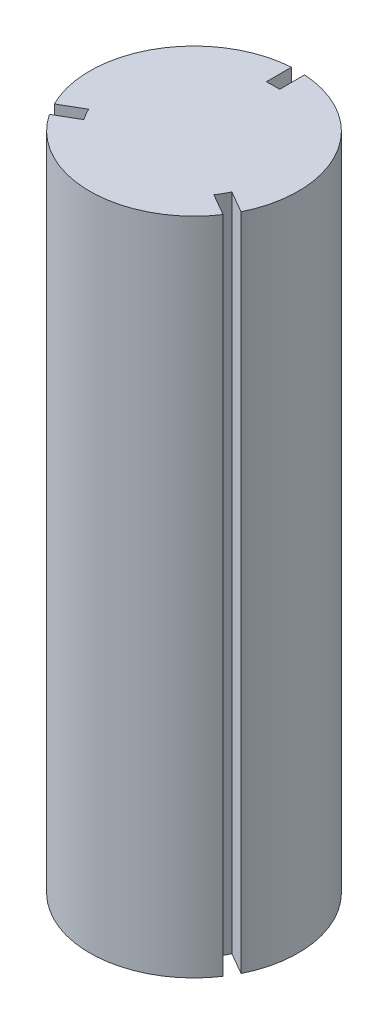
ISO-10303-21;
HEADER;
FILE_DESCRIPTION(('STEP AP214'),'2;1');
FILE_NAME('part.step','',(''),(''),'','','');
FILE_SCHEMA(('AUTOMOTIVE_DESIGN { 1 0 10303 214 1 1 1 1 }'));
ENDSEC;
DATA;
#1=APPLICATION_CONTEXT('core data for automotive mechanical design processes');
#2=APPLICATION_PROTOCOL_DEFINITION('international standard','automotive_design',2000,#1);
#3=PRODUCT_CONTEXT('',#1,'mechanical');
#4=PRODUCT('Part','Part','',(#3));
#5=PRODUCT_RELATED_PRODUCT_CATEGORY('part','',(#4));
#6=PRODUCT_DEFINITION_FORMATION('','',#4);
#7=PRODUCT_DEFINITION_CONTEXT('part definition',#1,'design');
#8=PRODUCT_DEFINITION('design','',#6,#7);
#9=PRODUCT_DEFINITION_SHAPE('','',#8);
#10=(LENGTH_UNIT() NAMED_UNIT(*) SI_UNIT(.MILLI.,.METRE.));
#11=(NAMED_UNIT(*) PLANE_ANGLE_UNIT() SI_UNIT($,.RADIAN.));
#12=(NAMED_UNIT(*) SI_UNIT($,.STERADIAN.) SOLID_ANGLE_UNIT());
#13=UNCERTAINTY_MEASURE_WITH_UNIT(LENGTH_MEASURE(1.E-05),#10,'distance_accuracy_value','');
#14=(GEOMETRIC_REPRESENTATION_CONTEXT(3) GLOBAL_UNCERTAINTY_ASSIGNED_CONTEXT((#13)) GLOBAL_UNIT_ASSIGNED_CONTEXT((#10,
#11,#12)) REPRESENTATION_CONTEXT('',''));
#15=CARTESIAN_POINT('',(0.,0.,0.));
#16=DIRECTION('',(0.,0.,1.));
#17=DIRECTION('',(1.,0.,0.));
#18=AXIS2_PLACEMENT_3D('',#15,#16,#17);
#19=CARTESIAN_POINT('',(0.,0.,0.));
#20=DIRECTION('',(0.,1.,0.));
#21=DIRECTION('',(0.,0.,1.));
#22=AXIS2_PLACEMENT_3D('',#19,#20,#21);
#23=CYLINDRICAL_SURFACE('',#22,3.);
#24=CARTESIAN_POINT('',(0.,25.,0.));
#25=DIRECTION('',(0.,1.,0.));
#26=DIRECTION('',(0.,0.,1.));
#27=AXIS2_PLACEMENT_3D('',#24,#25,#26);
#28=CIRCLE('',#27,3.);
#29=CARTESIAN_POINT('',(2.464039397151,25.,1.71128894383379));
#30=VERTEX_POINT('',#29);
#31=CARTESIAN_POINT('',(2.714039397151,25.,1.27827624194157));
#32=VERTEX_POINT('',#31);
#33=EDGE_CURVE('E225',#30,#32,#28,.T.);
#34=ORIENTED_EDGE('',*,*,#33,.F.);
#35=DIRECTION('',(0.,1.,0.));
#36=VECTOR('',#35,1.);
#37=CARTESIAN_POINT('',(2.464039397151,0.,1.71128894383379));
#38=LINE('',#37,#36);
#39=CARTESIAN_POINT('',(2.464039397151,0.,1.71128894383379));
#40=VERTEX_POINT('',#39);
#41=EDGE_CURVE('E218',#40,#30,#38,.T.);
#42=ORIENTED_EDGE('',*,*,#41,.F.);
#43=CARTESIAN_POINT('',(0.,0.,0.));
#44=DIRECTION('',(0.,1.,0.));
#45=DIRECTION('',(0.,0.,1.));
#46=AXIS2_PLACEMENT_3D('',#43,#44,#45);
#47=CIRCLE('',#46,3.);
#48=CARTESIAN_POINT('',(2.714039397151,0.,1.27827624194157));
#49=VERTEX_POINT('',#48);
#50=EDGE_CURVE('E207',#40,#49,#47,.T.);
#51=ORIENTED_EDGE('',*,*,#50,.T.);
#52=DIRECTION('',(0.,1.,0.));
#53=VECTOR('',#52,1.);
#54=CARTESIAN_POINT('',(2.714039397151,0.,1.27827624194157));
#55=LINE('',#54,#53);
#56=EDGE_CURVE('E212',#49,#32,#55,.T.);
#57=ORIENTED_EDGE('',*,*,#56,.T.);
#58=EDGE_LOOP('',(#34,#42,#51,#57));
#59=FACE_BOUND('',#58,.T.);
#60=ADVANCED_FACE('F44',(#59),#23,.T.);
#61=CARTESIAN_POINT('',(0.125,0.,-0.21650635094611));
#62=DIRECTION('',(-0.5,0.,0.866025403784439));
#63=DIRECTION('',(0.866025403784439,0.,0.5));
#64=AXIS2_PLACEMENT_3D('',#61,#62,#63);
#65=PLANE('',#64);
#66=DIRECTION('',(0.866025403784439,0.,0.5));
#67=VECTOR('',#66,1.);
#68=CARTESIAN_POINT('',(0.125,25.,-0.21650635094611));
#69=LINE('',#68,#67);
#70=CARTESIAN_POINT('',(3.53894200302231,25.,1.75453398349659));
#71=VERTEX_POINT('',#70);
#72=EDGE_CURVE('E202',#32,#71,#69,.T.);
#73=ORIENTED_EDGE('',*,*,#72,.F.);
#74=ORIENTED_EDGE('',*,*,#56,.F.);
#75=DIRECTION('',(0.866025403784439,0.,0.5));
#76=VECTOR('',#75,1.);
#77=CARTESIAN_POINT('',(0.125,0.,-0.21650635094611));
#78=LINE('',#77,#76);
#79=CARTESIAN_POINT('',(3.53894200302231,0.,1.75453398349659));
#80=VERTEX_POINT('',#79);
#81=EDGE_CURVE('E224',#49,#80,#78,.T.);
#82=ORIENTED_EDGE('',*,*,#81,.T.);
#83=DIRECTION('',(0.,1.,0.));
#84=VECTOR('',#83,1.);
#85=CARTESIAN_POINT('',(3.53894200302231,0.,1.75453398349659));
#86=LINE('',#85,#84);
#87=EDGE_CURVE('E211',#80,#71,#86,.T.);
#88=ORIENTED_EDGE('',*,*,#87,.T.);
#89=EDGE_LOOP('',(#73,#74,#82,#88));
#90=FACE_BOUND('',#89,.T.);
#91=ADVANCED_FACE('F279',(#90),#65,.T.);
#92=CARTESIAN_POINT('',(-0.125,0.,0.21650635094611));
#93=DIRECTION('',(-0.5,0.,0.866025403784438));
#94=DIRECTION('',(0.866025403784439,0.,0.5));
#95=AXIS2_PLACEMENT_3D('',#92,#93,#94);
#96=PLANE('',#95);
#97=DIRECTION('',(0.866025403784439,0.,0.5));
#98=VECTOR('',#97,1.);
#99=CARTESIAN_POINT('',(-0.125,25.,0.21650635094611));
#100=LINE('',#99,#98);
#101=CARTESIAN_POINT('',(3.28894200302231,25.,2.18754668538881));
#102=VERTEX_POINT('',#101);
#103=EDGE_CURVE('E209',#30,#102,#100,.T.);
#104=ORIENTED_EDGE('',*,*,#103,.T.);
#105=DIRECTION('',(0.,1.,0.));
#106=VECTOR('',#105,1.);
#107=CARTESIAN_POINT('',(3.28894200302231,0.,2.18754668538881));
#108=LINE('',#107,#106);
#109=CARTESIAN_POINT('',(3.28894200302231,0.,2.18754668538881));
#110=VERTEX_POINT('',#109);
#111=EDGE_CURVE('E214',#110,#102,#108,.T.);
#112=ORIENTED_EDGE('',*,*,#111,.F.);
#113=DIRECTION('',(0.866025403784439,0.,0.5));
#114=VECTOR('',#113,1.);
#115=CARTESIAN_POINT('',(-0.125,0.,0.21650635094611));
#116=LINE('',#115,#114);
#117=EDGE_CURVE('E137',#40,#110,#116,.T.);
#118=ORIENTED_EDGE('',*,*,#117,.F.);
#119=ORIENTED_EDGE('',*,*,#41,.T.);
#120=EDGE_LOOP('',(#104,#112,#118,#119));
#121=FACE_BOUND('',#120,.T.);
#122=ADVANCED_FACE('F276',(#121),#96,.F.);
#123=CARTESIAN_POINT('',(0.,25.,0.));
#124=DIRECTION('',(0.,-1.,0.));
#125=DIRECTION('',(0.,0.,-1.));
#126=AXIS2_PLACEMENT_3D('',#123,#124,#125);
#127=CYLINDRICAL_SURFACE('',#126,3.95);
#128=DIRECTION('',(0.,1.,0.));
#129=VECTOR('',#128,1.);
#130=CARTESIAN_POINT('',(-0.25,0.,-3.94208066888541));
#131=LINE('',#130,#129);
#132=CARTESIAN_POINT('',(-0.25,0.,-3.94208066888541));
#133=VERTEX_POINT('',#132);
#134=CARTESIAN_POINT('',(-0.25,25.,-3.94208066888541));
#135=VERTEX_POINT('',#134);
#136=EDGE_CURVE('E164',#133,#135,#131,.T.);
#137=ORIENTED_EDGE('',*,*,#136,.F.);
#138=CARTESIAN_POINT('',(0.,0.,0.));
#139=DIRECTION('',(0.,-1.,0.));
#140=DIRECTION('',(0.,0.,-1.));
#141=AXIS2_PLACEMENT_3D('',#138,#139,#140);
#142=CIRCLE('',#141,3.95);
#143=CARTESIAN_POINT('',(-3.53894200302232,0.,1.75453398349659));
#144=VERTEX_POINT('',#143);
#145=EDGE_CURVE('E172',#133,#144,#142,.F.);
#146=ORIENTED_EDGE('',*,*,#145,.T.);
#147=DIRECTION('',(0.,1.,0.));
#148=VECTOR('',#147,1.);
#149=CARTESIAN_POINT('',(-3.53894200302232,0.,1.75453398349659));
#150=LINE('',#149,#148);
#151=CARTESIAN_POINT('',(-3.53894200302232,25.,1.75453398349659));
#152=VERTEX_POINT('',#151);
#153=EDGE_CURVE('E195',#144,#152,#150,.T.);
#154=ORIENTED_EDGE('',*,*,#153,.T.);
#155=CARTESIAN_POINT('',(0.,25.,0.));
#156=DIRECTION('',(0.,-1.,0.));
#157=DIRECTION('',(0.,0.,-1.));
#158=AXIS2_PLACEMENT_3D('',#155,#156,#157);
#159=CIRCLE('',#158,3.95);
#160=EDGE_CURVE('E57',#135,#152,#159,.F.);
#161=ORIENTED_EDGE('',*,*,#160,.F.);
#162=EDGE_LOOP('',(#137,#146,#154,#161));
#163=FACE_BOUND('',#162,.T.);
#164=ADVANCED_FACE('F282',(#163),#127,.T.);
#165=DIRECTION('',(0.,1.,0.));
#166=VECTOR('',#165,1.);
#167=CARTESIAN_POINT('',(-3.28894200302232,0.,2.18754668538881));
#168=LINE('',#167,#166);
#169=CARTESIAN_POINT('',(-3.28894200302232,0.,2.18754668538881));
#170=VERTEX_POINT('',#169);
#171=CARTESIAN_POINT('',(-3.28894200302232,25.,2.18754668538881));
#172=VERTEX_POINT('',#171);
#173=EDGE_CURVE('E189',#170,#172,#168,.T.);
#174=ORIENTED_EDGE('',*,*,#173,.F.);
#175=CARTESIAN_POINT('',(0.,0.,0.));
#176=DIRECTION('',(0.,-1.,0.));
#177=DIRECTION('',(0.,0.,-1.));
#178=AXIS2_PLACEMENT_3D('',#175,#176,#177);
#179=CIRCLE('',#178,3.95);
#180=EDGE_CURVE('E47',#170,#110,#179,.F.);
#181=ORIENTED_EDGE('',*,*,#180,.T.);
#182=ORIENTED_EDGE('',*,*,#111,.T.);
#183=CARTESIAN_POINT('',(0.,25.,0.));
#184=DIRECTION('',(0.,-1.,0.));
#185=DIRECTION('',(0.,0.,-1.));
#186=AXIS2_PLACEMENT_3D('',#183,#184,#185);
#187=CIRCLE('',#186,3.95);
#188=EDGE_CURVE('E231',#172,#102,#187,.F.);
#189=ORIENTED_EDGE('',*,*,#188,.F.);
#190=EDGE_LOOP('',(#174,#181,#182,#189));
#191=FACE_BOUND('',#190,.T.);
#192=ADVANCED_FACE('F241',(#191),#127,.T.);
#193=CARTESIAN_POINT('',(0.,0.,0.));
#194=DIRECTION('',(0.,1.,0.));
#195=DIRECTION('',(0.,0.,1.));
#196=AXIS2_PLACEMENT_3D('',#193,#194,#195);
#197=PLANE('',#196);
#198=DIRECTION('',(0.,0.,-1.));
#199=VECTOR('',#198,1.);
#200=CARTESIAN_POINT('',(-0.25,0.,0.));
#201=LINE('',#200,#199);
#202=CARTESIAN_POINT('',(-0.25,0.,-2.98956518577535));
#203=VERTEX_POINT('',#202);
#204=EDGE_CURVE('E161',#203,#133,#201,.T.);
#205=ORIENTED_EDGE('',*,*,#204,.F.);
#206=CARTESIAN_POINT('',(0.,0.,0.));
#207=DIRECTION('',(0.,1.,0.));
#208=DIRECTION('',(0.,0.,1.));
#209=AXIS2_PLACEMENT_3D('',#206,#207,#208);
#210=CIRCLE('',#209,3.);
#211=CARTESIAN_POINT('',(0.25,0.,-2.98956518577535));
#212=VERTEX_POINT('',#211);
#213=EDGE_CURVE('E148',#212,#203,#210,.T.);
#214=ORIENTED_EDGE('',*,*,#213,.F.);
#215=DIRECTION('',(0.,0.,-1.));
#216=VECTOR('',#215,1.);
#217=CARTESIAN_POINT('',(0.25,0.,0.));
#218=LINE('',#217,#216);
#219=CARTESIAN_POINT('',(0.249999999999998,0.,-3.94208066888541));
#220=VERTEX_POINT('',#219);
#221=EDGE_CURVE('E63',#212,#220,#218,.T.);
#222=ORIENTED_EDGE('',*,*,#221,.T.);
#223=CARTESIAN_POINT('',(0.,0.,0.));
#224=DIRECTION('',(0.,-1.,0.));
#225=DIRECTION('',(0.,0.,-1.));
#226=AXIS2_PLACEMENT_3D('',#223,#224,#225);
#227=CIRCLE('',#226,3.95);
#228=EDGE_CURVE('E234',#80,#220,#227,.F.);
#229=ORIENTED_EDGE('',*,*,#228,.F.);
#230=ORIENTED_EDGE('',*,*,#81,.F.);
#231=ORIENTED_EDGE('',*,*,#50,.F.);
#232=ORIENTED_EDGE('',*,*,#117,.T.);
#233=ORIENTED_EDGE('',*,*,#180,.F.);
#234=DIRECTION('',(-0.866025403784439,0.,0.5));
#235=VECTOR('',#234,1.);
#236=CARTESIAN_POINT('',(0.125,0.,0.21650635094611));
#237=LINE('',#236,#235);
#238=CARTESIAN_POINT('',(-2.464039397151,0.,1.71128894383378));
#239=VERTEX_POINT('',#238);
#240=EDGE_CURVE('E111',#239,#170,#237,.T.);
#241=ORIENTED_EDGE('',*,*,#240,.F.);
#242=CARTESIAN_POINT('',(0.,0.,0.));
#243=DIRECTION('',(0.,1.,0.));
#244=DIRECTION('',(0.,0.,1.));
#245=AXIS2_PLACEMENT_3D('',#242,#243,#244);
#246=CIRCLE('',#245,3.);
#247=CARTESIAN_POINT('',(-2.714039397151,0.,1.27827624194156));
#248=VERTEX_POINT('',#247);
#249=EDGE_CURVE('E125',#248,#239,#246,.T.);
#250=ORIENTED_EDGE('',*,*,#249,.F.);
#251=DIRECTION('',(-0.866025403784439,0.,0.5));
#252=VECTOR('',#251,1.);
#253=CARTESIAN_POINT('',(-0.125,0.,-0.21650635094611));
#254=LINE('',#253,#252);
#255=EDGE_CURVE('E205',#248,#144,#254,.T.);
#256=ORIENTED_EDGE('',*,*,#255,.T.);
#257=ORIENTED_EDGE('',*,*,#145,.F.);
#258=EDGE_LOOP('',(#205,#214,#222,#229,#230,#231,#232,#233,#241,#250,#256,#257));
#259=FACE_BOUND('',#258,.T.);
#260=ADVANCED_FACE('F169',(#259),#197,.F.);
#261=ORIENTED_EDGE('',*,*,#228,.T.);
#262=DIRECTION('',(0.,1.,0.));
#263=VECTOR('',#262,1.);
#264=CARTESIAN_POINT('',(0.249999999999996,0.,-3.94208066888541));
#265=LINE('',#264,#263);
#266=CARTESIAN_POINT('',(0.249999999999998,25.,-3.94208066888541));
#267=VERTEX_POINT('',#266);
#268=EDGE_CURVE('E176',#220,#267,#265,.T.);
#269=ORIENTED_EDGE('',*,*,#268,.T.);
#270=CARTESIAN_POINT('',(0.,25.,0.));
#271=DIRECTION('',(0.,-1.,0.));
#272=DIRECTION('',(0.,0.,-1.));
#273=AXIS2_PLACEMENT_3D('',#270,#271,#272);
#274=CIRCLE('',#273,3.95);
#275=EDGE_CURVE('E11',#71,#267,#274,.F.);
#276=ORIENTED_EDGE('',*,*,#275,.F.);
#277=ORIENTED_EDGE('',*,*,#87,.F.);
#278=EDGE_LOOP('',(#261,#269,#276,#277));
#279=FACE_BOUND('',#278,.T.);
#280=ADVANCED_FACE('F50',(#279),#127,.T.);
#281=CARTESIAN_POINT('',(0.,25.,0.));
#282=DIRECTION('',(0.,1.,0.));
#283=DIRECTION('',(0.,0.,1.));
#284=AXIS2_PLACEMENT_3D('',#281,#282,#283);
#285=PLANE('',#284);
#286=DIRECTION('',(0.,0.,-1.));
#287=VECTOR('',#286,1.);
#288=CARTESIAN_POINT('',(0.25,25.,0.));
#289=LINE('',#288,#287);
#290=CARTESIAN_POINT('',(0.25,25.,-2.98956518577535));
#291=VERTEX_POINT('',#290);
#292=EDGE_CURVE('E179',#291,#267,#289,.T.);
#293=ORIENTED_EDGE('',*,*,#292,.F.);
#294=CARTESIAN_POINT('',(0.,25.,0.));
#295=DIRECTION('',(0.,1.,0.));
#296=DIRECTION('',(0.,0.,1.));
#297=AXIS2_PLACEMENT_3D('',#294,#295,#296);
#298=CIRCLE('',#297,3.);
#299=CARTESIAN_POINT('',(-0.25,25.,-2.98956518577535));
#300=VERTEX_POINT('',#299);
#301=EDGE_CURVE('E391',#291,#300,#298,.T.);
#302=ORIENTED_EDGE('',*,*,#301,.T.);
#303=DIRECTION('',(0.,0.,-1.));
#304=VECTOR('',#303,1.);
#305=CARTESIAN_POINT('',(-0.25,25.,0.));
#306=LINE('',#305,#304);
#307=EDGE_CURVE('E156',#300,#135,#306,.T.);
#308=ORIENTED_EDGE('',*,*,#307,.T.);
#309=ORIENTED_EDGE('',*,*,#160,.T.);
#310=DIRECTION('',(-0.866025403784439,0.,0.5));
#311=VECTOR('',#310,1.);
#312=CARTESIAN_POINT('',(-0.125,25.,-0.21650635094611));
#313=LINE('',#312,#311);
#314=CARTESIAN_POINT('',(-2.714039397151,25.,1.27827624194156));
#315=VERTEX_POINT('',#314);
#316=EDGE_CURVE('E190',#315,#152,#313,.T.);
#317=ORIENTED_EDGE('',*,*,#316,.F.);
#318=CARTESIAN_POINT('',(0.,25.,0.));
#319=DIRECTION('',(0.,1.,0.));
#320=DIRECTION('',(0.,0.,1.));
#321=AXIS2_PLACEMENT_3D('',#318,#319,#320);
#322=CIRCLE('',#321,3.);
#323=CARTESIAN_POINT('',(-2.464039397151,25.,1.71128894383378));
#324=VERTEX_POINT('',#323);
#325=EDGE_CURVE('E200',#315,#324,#322,.T.);
#326=ORIENTED_EDGE('',*,*,#325,.T.);
#327=DIRECTION('',(-0.866025403784439,0.,0.5));
#328=VECTOR('',#327,1.);
#329=CARTESIAN_POINT('',(0.125,25.,0.21650635094611));
#330=LINE('',#329,#328);
#331=EDGE_CURVE('E181',#324,#172,#330,.T.);
#332=ORIENTED_EDGE('',*,*,#331,.T.);
#333=ORIENTED_EDGE('',*,*,#188,.T.);
#334=ORIENTED_EDGE('',*,*,#103,.F.);
#335=ORIENTED_EDGE('',*,*,#33,.T.);
#336=ORIENTED_EDGE('',*,*,#72,.T.);
#337=ORIENTED_EDGE('',*,*,#275,.T.);
#338=EDGE_LOOP('',(#293,#302,#308,#309,#317,#326,#332,#333,#334,#335,#336,#337));
#339=FACE_BOUND('',#338,.T.);
#340=ADVANCED_FACE('F273',(#339),#285,.T.);
#341=CARTESIAN_POINT('',(0.,0.,0.));
#342=DIRECTION('',(0.,1.,0.));
#343=DIRECTION('',(0.,0.,1.));
#344=AXIS2_PLACEMENT_3D('',#341,#342,#343);
#345=CYLINDRICAL_SURFACE('',#344,3.);
#346=ORIENTED_EDGE('',*,*,#325,.F.);
#347=DIRECTION('',(0.,1.,0.));
#348=VECTOR('',#347,1.);
#349=CARTESIAN_POINT('',(-2.714039397151,0.,1.27827624194156));
#350=LINE('',#349,#348);
#351=EDGE_CURVE('E198',#248,#315,#350,.T.);
#352=ORIENTED_EDGE('',*,*,#351,.F.);
#353=ORIENTED_EDGE('',*,*,#249,.T.);
#354=DIRECTION('',(0.,1.,0.));
#355=VECTOR('',#354,1.);
#356=CARTESIAN_POINT('',(-2.464039397151,0.,1.71128894383378));
#357=LINE('',#356,#355);
#358=EDGE_CURVE('E191',#239,#324,#357,.T.);
#359=ORIENTED_EDGE('',*,*,#358,.T.);
#360=EDGE_LOOP('',(#346,#352,#353,#359));
#361=FACE_BOUND('',#360,.T.);
#362=ADVANCED_FACE('F294',(#361),#345,.T.);
#363=CARTESIAN_POINT('',(0.125,0.,0.21650635094611));
#364=DIRECTION('',(-0.5,0.,-0.866025403784439));
#365=DIRECTION('',(-0.866025403784439,0.,0.5));
#366=AXIS2_PLACEMENT_3D('',#363,#364,#365);
#367=PLANE('',#366);
#368=ORIENTED_EDGE('',*,*,#331,.F.);
#369=ORIENTED_EDGE('',*,*,#358,.F.);
#370=ORIENTED_EDGE('',*,*,#240,.T.);
#371=ORIENTED_EDGE('',*,*,#173,.T.);
#372=EDGE_LOOP('',(#368,#369,#370,#371));
#373=FACE_BOUND('',#372,.T.);
#374=ADVANCED_FACE('F327',(#373),#367,.T.);
#375=CARTESIAN_POINT('',(-0.125,0.,-0.21650635094611));
#376=DIRECTION('',(-0.5,0.,-0.866025403784439));
#377=DIRECTION('',(-0.866025403784439,0.,0.5));
#378=AXIS2_PLACEMENT_3D('',#375,#376,#377);
#379=PLANE('',#378);
#380=ORIENTED_EDGE('',*,*,#316,.T.);
#381=ORIENTED_EDGE('',*,*,#153,.F.);
#382=ORIENTED_EDGE('',*,*,#255,.F.);
#383=ORIENTED_EDGE('',*,*,#351,.T.);
#384=EDGE_LOOP('',(#380,#381,#382,#383));
#385=FACE_BOUND('',#384,.T.);
#386=ADVANCED_FACE('F337',(#385),#379,.F.);
#387=CARTESIAN_POINT('',(0.,0.,0.));
#388=DIRECTION('',(0.,1.,0.));
#389=DIRECTION('',(0.,0.,1.));
#390=AXIS2_PLACEMENT_3D('',#387,#388,#389);
#391=CYLINDRICAL_SURFACE('',#390,3.);
#392=ORIENTED_EDGE('',*,*,#301,.F.);
#393=DIRECTION('',(0.,1.,0.));
#394=VECTOR('',#393,1.);
#395=CARTESIAN_POINT('',(0.25,0.,-2.98956518577535));
#396=LINE('',#395,#394);
#397=EDGE_CURVE('E155',#212,#291,#396,.T.);
#398=ORIENTED_EDGE('',*,*,#397,.F.);
#399=ORIENTED_EDGE('',*,*,#213,.T.);
#400=DIRECTION('',(0.,1.,0.));
#401=VECTOR('',#400,1.);
#402=CARTESIAN_POINT('',(-0.25,0.,-2.98956518577535));
#403=LINE('',#402,#401);
#404=EDGE_CURVE('E147',#203,#300,#403,.T.);
#405=ORIENTED_EDGE('',*,*,#404,.T.);
#406=EDGE_LOOP('',(#392,#398,#399,#405));
#407=FACE_BOUND('',#406,.T.);
#408=ADVANCED_FACE('F149',(#407),#391,.T.);
#409=CARTESIAN_POINT('',(-0.25,0.,0.));
#410=DIRECTION('',(1.,0.,0.));
#411=DIRECTION('',(0.,0.,-1.));
#412=AXIS2_PLACEMENT_3D('',#409,#410,#411);
#413=PLANE('',#412);
#414=ORIENTED_EDGE('',*,*,#307,.F.);
#415=ORIENTED_EDGE('',*,*,#404,.F.);
#416=ORIENTED_EDGE('',*,*,#204,.T.);
#417=ORIENTED_EDGE('',*,*,#136,.T.);
#418=EDGE_LOOP('',(#414,#415,#416,#417));
#419=FACE_BOUND('',#418,.T.);
#420=ADVANCED_FACE('F159',(#419),#413,.T.);
#421=CARTESIAN_POINT('',(0.25,0.,0.));
#422=DIRECTION('',(1.,0.,0.));
#423=DIRECTION('',(0.,0.,-1.));
#424=AXIS2_PLACEMENT_3D('',#421,#422,#423);
#425=PLANE('',#424);
#426=ORIENTED_EDGE('',*,*,#292,.T.);
#427=ORIENTED_EDGE('',*,*,#268,.F.);
#428=ORIENTED_EDGE('',*,*,#221,.F.);
#429=ORIENTED_EDGE('',*,*,#397,.T.);
#430=EDGE_LOOP('',(#426,#427,#428,#429));
#431=FACE_BOUND('',#430,.T.);
#432=ADVANCED_FACE('F357',(#431),#425,.F.);
#433=CLOSED_SHELL('',(#60,#91,#122,#164,#192,#260,#280,#340,#362,#374,#386,#408,#420,#432));
#434=MANIFOLD_SOLID_BREP('B2',#433);
#435=ADVANCED_BREP_SHAPE_REPRESENTATION('',(#18,#434),#14);
#436=SHAPE_DEFINITION_REPRESENTATION(#9,#435);
ENDSEC;
END-ISO-10303-21;
